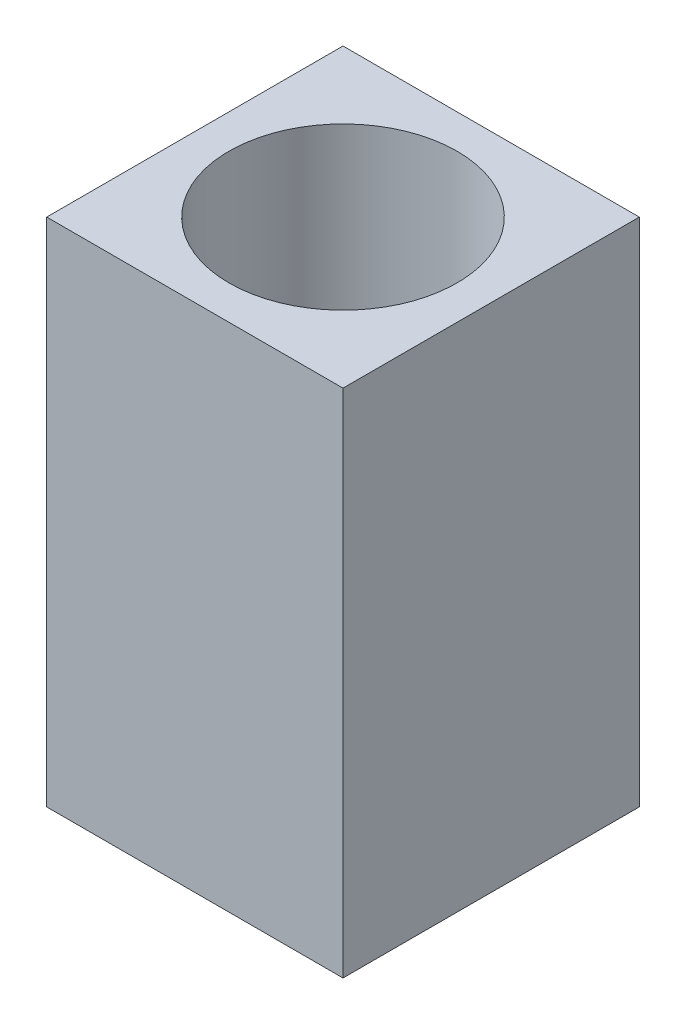
ISO-10303-21;
HEADER;
FILE_DESCRIPTION(('STEP AP214'),'2;1');
FILE_NAME('part.step','',(''),(''),'','','');
FILE_SCHEMA(('AUTOMOTIVE_DESIGN { 1 0 10303 214 1 1 1 1 }'));
ENDSEC;
DATA;
#1=APPLICATION_CONTEXT('core data for automotive mechanical design processes');
#2=APPLICATION_PROTOCOL_DEFINITION('international standard','automotive_design',2000,#1);
#3=PRODUCT_CONTEXT('',#1,'mechanical');
#4=PRODUCT('Part','Part','',(#3));
#5=PRODUCT_RELATED_PRODUCT_CATEGORY('part','',(#4));
#6=PRODUCT_DEFINITION_FORMATION('','',#4);
#7=PRODUCT_DEFINITION_CONTEXT('part definition',#1,'design');
#8=PRODUCT_DEFINITION('design','',#6,#7);
#9=PRODUCT_DEFINITION_SHAPE('','',#8);
#10=(LENGTH_UNIT() NAMED_UNIT(*) SI_UNIT(.MILLI.,.METRE.));
#11=(NAMED_UNIT(*) PLANE_ANGLE_UNIT() SI_UNIT($,.RADIAN.));
#12=(NAMED_UNIT(*) SI_UNIT($,.STERADIAN.) SOLID_ANGLE_UNIT());
#13=UNCERTAINTY_MEASURE_WITH_UNIT(LENGTH_MEASURE(1.E-05),#10,'distance_accuracy_value','');
#14=(GEOMETRIC_REPRESENTATION_CONTEXT(3) GLOBAL_UNCERTAINTY_ASSIGNED_CONTEXT((#13)) GLOBAL_UNIT_ASSIGNED_CONTEXT((#10,
#11,#12)) REPRESENTATION_CONTEXT('',''));
#15=CARTESIAN_POINT('',(0.,0.,0.));
#16=DIRECTION('',(0.,0.,1.));
#17=DIRECTION('',(1.,0.,0.));
#18=AXIS2_PLACEMENT_3D('',#15,#16,#17);
#19=CARTESIAN_POINT('',(17.4,60.,0.));
#20=DIRECTION('',(1.,0.,0.));
#21=DIRECTION('',(0.,0.,-1.));
#22=AXIS2_PLACEMENT_3D('',#19,#20,#21);
#23=PLANE('',#22);
#24=DIRECTION('',(0.,0.,1.));
#25=VECTOR('',#24,1.);
#26=CARTESIAN_POINT('',(17.4,0.,0.));
#27=LINE('',#26,#25);
#28=CARTESIAN_POINT('',(17.4,0.,-17.4));
#29=VERTEX_POINT('',#28);
#30=CARTESIAN_POINT('',(17.4,0.,17.4));
#31=VERTEX_POINT('',#30);
#32=EDGE_CURVE('E106',#29,#31,#27,.T.);
#33=ORIENTED_EDGE('',*,*,#32,.F.);
#34=DIRECTION('',(0.,-1.,0.));
#35=VECTOR('',#34,1.);
#36=CARTESIAN_POINT('',(17.4,60.,-17.4));
#37=LINE('',#36,#35);
#38=CARTESIAN_POINT('',(17.4,60.,-17.4));
#39=VERTEX_POINT('',#38);
#40=EDGE_CURVE('E11',#39,#29,#37,.T.);
#41=ORIENTED_EDGE('',*,*,#40,.F.);
#42=DIRECTION('',(0.,0.,1.));
#43=VECTOR('',#42,1.);
#44=CARTESIAN_POINT('',(17.4,60.,0.));
#45=LINE('',#44,#43);
#46=CARTESIAN_POINT('',(17.4,60.,17.4));
#47=VERTEX_POINT('',#46);
#48=EDGE_CURVE('E96',#39,#47,#45,.T.);
#49=ORIENTED_EDGE('',*,*,#48,.T.);
#50=DIRECTION('',(0.,-1.,0.));
#51=VECTOR('',#50,1.);
#52=CARTESIAN_POINT('',(17.4,60.,17.4));
#53=LINE('',#52,#51);
#54=EDGE_CURVE('E75',#47,#31,#53,.T.);
#55=ORIENTED_EDGE('',*,*,#54,.T.);
#56=EDGE_LOOP('',(#33,#41,#49,#55));
#57=FACE_BOUND('',#56,.T.);
#58=ADVANCED_FACE('F35',(#57),#23,.T.);
#59=CARTESIAN_POINT('',(0.,60.,-17.4));
#60=DIRECTION('',(0.,0.,-1.));
#61=DIRECTION('',(-1.,0.,0.));
#62=AXIS2_PLACEMENT_3D('',#59,#60,#61);
#63=PLANE('',#62);
#64=DIRECTION('',(1.,0.,0.));
#65=VECTOR('',#64,1.);
#66=CARTESIAN_POINT('',(0.,0.,-17.4));
#67=LINE('',#66,#65);
#68=CARTESIAN_POINT('',(-17.4,0.,-17.4));
#69=VERTEX_POINT('',#68);
#70=EDGE_CURVE('E87',#69,#29,#67,.T.);
#71=ORIENTED_EDGE('',*,*,#70,.F.);
#72=DIRECTION('',(0.,-1.,0.));
#73=VECTOR('',#72,1.);
#74=CARTESIAN_POINT('',(-17.4,60.,-17.4));
#75=LINE('',#74,#73);
#76=CARTESIAN_POINT('',(-17.4,60.,-17.4));
#77=VERTEX_POINT('',#76);
#78=EDGE_CURVE('E44',#77,#69,#75,.T.);
#79=ORIENTED_EDGE('',*,*,#78,.F.);
#80=DIRECTION('',(1.,0.,0.));
#81=VECTOR('',#80,1.);
#82=CARTESIAN_POINT('',(0.,60.,-17.4));
#83=LINE('',#82,#81);
#84=EDGE_CURVE('E85',#77,#39,#83,.T.);
#85=ORIENTED_EDGE('',*,*,#84,.T.);
#86=ORIENTED_EDGE('',*,*,#40,.T.);
#87=EDGE_LOOP('',(#71,#79,#85,#86));
#88=FACE_BOUND('',#87,.T.);
#89=ADVANCED_FACE('F83',(#88),#63,.T.);
#90=CARTESIAN_POINT('',(-17.4,60.,0.));
#91=DIRECTION('',(1.,0.,0.));
#92=DIRECTION('',(0.,0.,-1.));
#93=AXIS2_PLACEMENT_3D('',#90,#91,#92);
#94=PLANE('',#93);
#95=DIRECTION('',(0.,0.,1.));
#96=VECTOR('',#95,1.);
#97=CARTESIAN_POINT('',(-17.4,0.,0.));
#98=LINE('',#97,#96);
#99=CARTESIAN_POINT('',(-17.4,0.,17.4));
#100=VERTEX_POINT('',#99);
#101=EDGE_CURVE('E109',#69,#100,#98,.T.);
#102=ORIENTED_EDGE('',*,*,#101,.T.);
#103=DIRECTION('',(0.,-1.,0.));
#104=VECTOR('',#103,1.);
#105=CARTESIAN_POINT('',(-17.4,60.,17.4));
#106=LINE('',#105,#104);
#107=CARTESIAN_POINT('',(-17.4,60.,17.4));
#108=VERTEX_POINT('',#107);
#109=EDGE_CURVE('E90',#108,#100,#106,.T.);
#110=ORIENTED_EDGE('',*,*,#109,.F.);
#111=DIRECTION('',(0.,0.,1.));
#112=VECTOR('',#111,1.);
#113=CARTESIAN_POINT('',(-17.4,60.,0.));
#114=LINE('',#113,#112);
#115=EDGE_CURVE('E92',#77,#108,#114,.T.);
#116=ORIENTED_EDGE('',*,*,#115,.F.);
#117=ORIENTED_EDGE('',*,*,#78,.T.);
#118=EDGE_LOOP('',(#102,#110,#116,#117));
#119=FACE_BOUND('',#118,.T.);
#120=ADVANCED_FACE('F93',(#119),#94,.F.);
#121=CARTESIAN_POINT('',(0.,60.,0.));
#122=DIRECTION('',(0.,-1.,0.));
#123=DIRECTION('',(0.,0.,-1.));
#124=AXIS2_PLACEMENT_3D('',#121,#122,#123);
#125=CYLINDRICAL_SURFACE('',#124,13.4);
#126=CARTESIAN_POINT('',(0.,60.,0.));
#127=DIRECTION('',(0.,1.,0.));
#128=DIRECTION('',(0.,0.,1.));
#129=AXIS2_PLACEMENT_3D('',#126,#127,#128);
#130=CIRCLE('',#129,13.4);
#131=CARTESIAN_POINT('',(0.,60.,13.4));
#132=VERTEX_POINT('',#131);
#133=EDGE_CURVE('E98',#132,#132,#130,.T.);
#134=ORIENTED_EDGE('',*,*,#133,.T.);
#135=EDGE_LOOP('',(#134));
#136=FACE_BOUND('',#135,.T.);
#137=CARTESIAN_POINT('',(0.,0.,0.));
#138=DIRECTION('',(0.,1.,0.));
#139=DIRECTION('',(0.,0.,1.));
#140=AXIS2_PLACEMENT_3D('',#137,#138,#139);
#141=CIRCLE('',#140,13.4);
#142=CARTESIAN_POINT('',(0.,0.,13.4));
#143=VERTEX_POINT('',#142);
#144=EDGE_CURVE('E103',#143,#143,#141,.T.);
#145=ORIENTED_EDGE('',*,*,#144,.F.);
#146=EDGE_LOOP('',(#145));
#147=FACE_BOUND('',#146,.T.);
#148=ADVANCED_FACE('F37',(#136,#147),#125,.F.);
#149=CARTESIAN_POINT('',(0.,60.,17.4));
#150=DIRECTION('',(0.,0.,-1.));
#151=DIRECTION('',(-1.,0.,0.));
#152=AXIS2_PLACEMENT_3D('',#149,#150,#151);
#153=PLANE('',#152);
#154=DIRECTION('',(1.,0.,0.));
#155=VECTOR('',#154,1.);
#156=CARTESIAN_POINT('',(0.,0.,17.4));
#157=LINE('',#156,#155);
#158=EDGE_CURVE('E68',#100,#31,#157,.T.);
#159=ORIENTED_EDGE('',*,*,#158,.T.);
#160=ORIENTED_EDGE('',*,*,#54,.F.);
#161=DIRECTION('',(1.,0.,0.));
#162=VECTOR('',#161,1.);
#163=CARTESIAN_POINT('',(0.,60.,17.4));
#164=LINE('',#163,#162);
#165=EDGE_CURVE('E52',#108,#47,#164,.T.);
#166=ORIENTED_EDGE('',*,*,#165,.F.);
#167=ORIENTED_EDGE('',*,*,#109,.T.);
#168=EDGE_LOOP('',(#159,#160,#166,#167));
#169=FACE_BOUND('',#168,.T.);
#170=ADVANCED_FACE('F114',(#169),#153,.F.);
#171=CARTESIAN_POINT('',(0.,60.,0.));
#172=DIRECTION('',(0.,1.,0.));
#173=DIRECTION('',(0.,0.,1.));
#174=AXIS2_PLACEMENT_3D('',#171,#172,#173);
#175=PLANE('',#174);
#176=ORIENTED_EDGE('',*,*,#133,.F.);
#177=EDGE_LOOP('',(#176));
#178=FACE_BOUND('',#177,.T.);
#179=ORIENTED_EDGE('',*,*,#48,.F.);
#180=ORIENTED_EDGE('',*,*,#84,.F.);
#181=ORIENTED_EDGE('',*,*,#115,.T.);
#182=ORIENTED_EDGE('',*,*,#165,.T.);
#183=EDGE_LOOP('',(#179,#180,#181,#182));
#184=FACE_BOUND('',#183,.T.);
#185=ADVANCED_FACE('F95',(#178,#184),#175,.T.);
#186=CARTESIAN_POINT('',(0.,0.,0.));
#187=DIRECTION('',(0.,1.,0.));
#188=DIRECTION('',(0.,0.,1.));
#189=AXIS2_PLACEMENT_3D('',#186,#187,#188);
#190=PLANE('',#189);
#191=ORIENTED_EDGE('',*,*,#144,.T.);
#192=EDGE_LOOP('',(#191));
#193=FACE_BOUND('',#192,.T.);
#194=ORIENTED_EDGE('',*,*,#32,.T.);
#195=ORIENTED_EDGE('',*,*,#158,.F.);
#196=ORIENTED_EDGE('',*,*,#101,.F.);
#197=ORIENTED_EDGE('',*,*,#70,.T.);
#198=EDGE_LOOP('',(#194,#195,#196,#197));
#199=FACE_BOUND('',#198,.T.);
#200=ADVANCED_FACE('F115',(#193,#199),#190,.F.);
#201=CLOSED_SHELL('',(#58,#89,#120,#148,#170,#185,#200));
#202=MANIFOLD_SOLID_BREP('B2',#201);
#203=ADVANCED_BREP_SHAPE_REPRESENTATION('',(#18,#202),#14);
#204=SHAPE_DEFINITION_REPRESENTATION(#9,#203);
ENDSEC;
END-ISO-10303-21;
